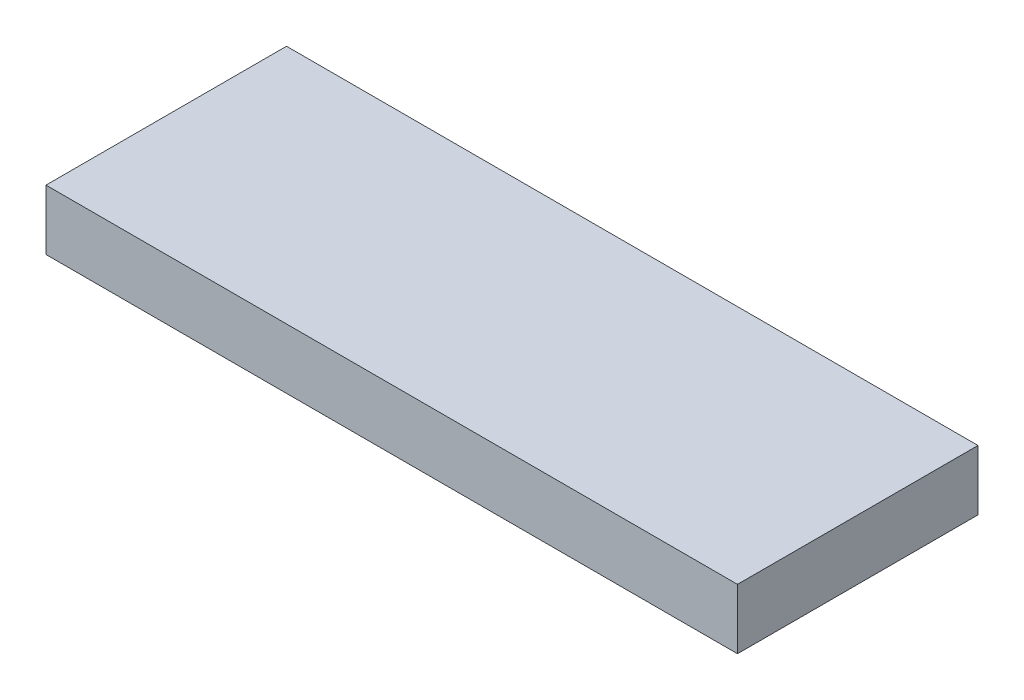
ISO-10303-21;
HEADER;
FILE_DESCRIPTION(('STEP AP214'),'2;1');
FILE_NAME('part.step','',(''),(''),'','','');
FILE_SCHEMA(('AUTOMOTIVE_DESIGN { 1 0 10303 214 1 1 1 1 }'));
ENDSEC;
DATA;
#1=APPLICATION_CONTEXT('core data for automotive mechanical design processes');
#2=APPLICATION_PROTOCOL_DEFINITION('international standard','automotive_design',2000,#1);
#3=PRODUCT_CONTEXT('',#1,'mechanical');
#4=PRODUCT('Part','Part','',(#3));
#5=PRODUCT_RELATED_PRODUCT_CATEGORY('part','',(#4));
#6=PRODUCT_DEFINITION_FORMATION('','',#4);
#7=PRODUCT_DEFINITION_CONTEXT('part definition',#1,'design');
#8=PRODUCT_DEFINITION('design','',#6,#7);
#9=PRODUCT_DEFINITION_SHAPE('','',#8);
#10=(LENGTH_UNIT() NAMED_UNIT(*) SI_UNIT(.MILLI.,.METRE.));
#11=(NAMED_UNIT(*) PLANE_ANGLE_UNIT() SI_UNIT($,.RADIAN.));
#12=(NAMED_UNIT(*) SI_UNIT($,.STERADIAN.) SOLID_ANGLE_UNIT());
#13=UNCERTAINTY_MEASURE_WITH_UNIT(LENGTH_MEASURE(1.E-05),#10,'distance_accuracy_value','');
#14=(GEOMETRIC_REPRESENTATION_CONTEXT(3) GLOBAL_UNCERTAINTY_ASSIGNED_CONTEXT((#13)) GLOBAL_UNIT_ASSIGNED_CONTEXT((#10,
#11,#12)) REPRESENTATION_CONTEXT('',''));
#15=CARTESIAN_POINT('',(0.,0.,0.));
#16=DIRECTION('',(0.,0.,1.));
#17=DIRECTION('',(1.,0.,0.));
#18=AXIS2_PLACEMENT_3D('',#15,#16,#17);
#19=CARTESIAN_POINT('',(0.,6.35,0.));
#20=DIRECTION('',(1.,0.,0.));
#21=DIRECTION('',(0.,0.,-1.));
#22=AXIS2_PLACEMENT_3D('',#19,#20,#21);
#23=PLANE('',#22);
#24=DIRECTION('',(0.,0.,1.));
#25=VECTOR('',#24,1.);
#26=CARTESIAN_POINT('',(0.,0.,0.));
#27=LINE('',#26,#25);
#28=CARTESIAN_POINT('',(0.,0.,-25.4));
#29=VERTEX_POINT('',#28);
#30=CARTESIAN_POINT('',(0.,0.,0.));
#31=VERTEX_POINT('',#30);
#32=EDGE_CURVE('E102',#29,#31,#27,.T.);
#33=ORIENTED_EDGE('',*,*,#32,.T.);
#34=DIRECTION('',(0.,-1.,0.));
#35=VECTOR('',#34,1.);
#36=CARTESIAN_POINT('',(0.,6.35,0.));
#37=LINE('',#36,#35);
#38=CARTESIAN_POINT('',(0.,6.35,0.));
#39=VERTEX_POINT('',#38);
#40=EDGE_CURVE('E11',#39,#31,#37,.T.);
#41=ORIENTED_EDGE('',*,*,#40,.F.);
#42=DIRECTION('',(0.,0.,1.));
#43=VECTOR('',#42,1.);
#44=CARTESIAN_POINT('',(0.,6.35,0.));
#45=LINE('',#44,#43);
#46=CARTESIAN_POINT('',(0.,6.35,-25.4));
#47=VERTEX_POINT('',#46);
#48=EDGE_CURVE('E90',#47,#39,#45,.T.);
#49=ORIENTED_EDGE('',*,*,#48,.F.);
#50=DIRECTION('',(0.,-1.,0.));
#51=VECTOR('',#50,1.);
#52=CARTESIAN_POINT('',(0.,6.35,-25.4));
#53=LINE('',#52,#51);
#54=EDGE_CURVE('E98',#47,#29,#53,.T.);
#55=ORIENTED_EDGE('',*,*,#54,.T.);
#56=EDGE_LOOP('',(#33,#41,#49,#55));
#57=FACE_BOUND('',#56,.T.);
#58=ADVANCED_FACE('F39',(#57),#23,.F.);
#59=CARTESIAN_POINT('',(0.,6.35,0.));
#60=DIRECTION('',(0.,0.,-1.));
#61=DIRECTION('',(-1.,0.,0.));
#62=AXIS2_PLACEMENT_3D('',#59,#60,#61);
#63=PLANE('',#62);
#64=DIRECTION('',(1.,0.,0.));
#65=VECTOR('',#64,1.);
#66=CARTESIAN_POINT('',(0.,0.,0.));
#67=LINE('',#66,#65);
#68=CARTESIAN_POINT('',(73.025,0.,0.));
#69=VERTEX_POINT('',#68);
#70=EDGE_CURVE('E94',#31,#69,#67,.T.);
#71=ORIENTED_EDGE('',*,*,#70,.T.);
#72=DIRECTION('',(0.,-1.,0.));
#73=VECTOR('',#72,1.);
#74=CARTESIAN_POINT('',(73.025,6.35,0.));
#75=LINE('',#74,#73);
#76=CARTESIAN_POINT('',(73.025,6.35,0.));
#77=VERTEX_POINT('',#76);
#78=EDGE_CURVE('E47',#77,#69,#75,.T.);
#79=ORIENTED_EDGE('',*,*,#78,.F.);
#80=DIRECTION('',(1.,0.,0.));
#81=VECTOR('',#80,1.);
#82=CARTESIAN_POINT('',(0.,6.35,0.));
#83=LINE('',#82,#81);
#84=EDGE_CURVE('E85',#39,#77,#83,.T.);
#85=ORIENTED_EDGE('',*,*,#84,.F.);
#86=ORIENTED_EDGE('',*,*,#40,.T.);
#87=EDGE_LOOP('',(#71,#79,#85,#86));
#88=FACE_BOUND('',#87,.T.);
#89=ADVANCED_FACE('F93',(#88),#63,.F.);
#90=CARTESIAN_POINT('',(73.025,6.35,-25.4));
#91=DIRECTION('',(-1.,0.,0.));
#92=DIRECTION('',(0.,0.,1.));
#93=AXIS2_PLACEMENT_3D('',#90,#91,#92);
#94=PLANE('',#93);
#95=DIRECTION('',(0.,0.,-1.));
#96=VECTOR('',#95,1.);
#97=CARTESIAN_POINT('',(73.025,0.,-25.4));
#98=LINE('',#97,#96);
#99=CARTESIAN_POINT('',(73.025,0.,-25.4));
#100=VERTEX_POINT('',#99);
#101=EDGE_CURVE('E72',#69,#100,#98,.T.);
#102=ORIENTED_EDGE('',*,*,#101,.T.);
#103=DIRECTION('',(0.,-1.,0.));
#104=VECTOR('',#103,1.);
#105=CARTESIAN_POINT('',(73.025,6.35,-25.4));
#106=LINE('',#105,#104);
#107=CARTESIAN_POINT('',(73.025,6.35,-25.4));
#108=VERTEX_POINT('',#107);
#109=EDGE_CURVE('E95',#108,#100,#106,.T.);
#110=ORIENTED_EDGE('',*,*,#109,.F.);
#111=DIRECTION('',(0.,0.,-1.));
#112=VECTOR('',#111,1.);
#113=CARTESIAN_POINT('',(73.025,6.35,-25.4));
#114=LINE('',#113,#112);
#115=EDGE_CURVE('E88',#77,#108,#114,.T.);
#116=ORIENTED_EDGE('',*,*,#115,.F.);
#117=ORIENTED_EDGE('',*,*,#78,.T.);
#118=EDGE_LOOP('',(#102,#110,#116,#117));
#119=FACE_BOUND('',#118,.T.);
#120=ADVANCED_FACE('F96',(#119),#94,.F.);
#121=CARTESIAN_POINT('',(0.,6.35,-25.4));
#122=DIRECTION('',(0.,0.,1.));
#123=DIRECTION('',(1.,0.,0.));
#124=AXIS2_PLACEMENT_3D('',#121,#122,#123);
#125=PLANE('',#124);
#126=DIRECTION('',(-1.,0.,0.));
#127=VECTOR('',#126,1.);
#128=CARTESIAN_POINT('',(0.,0.,-25.4));
#129=LINE('',#128,#127);
#130=EDGE_CURVE('E78',#100,#29,#129,.T.);
#131=ORIENTED_EDGE('',*,*,#130,.T.);
#132=ORIENTED_EDGE('',*,*,#54,.F.);
#133=DIRECTION('',(-1.,0.,0.));
#134=VECTOR('',#133,1.);
#135=CARTESIAN_POINT('',(0.,6.35,-25.4));
#136=LINE('',#135,#134);
#137=EDGE_CURVE('E55',#108,#47,#136,.T.);
#138=ORIENTED_EDGE('',*,*,#137,.F.);
#139=ORIENTED_EDGE('',*,*,#109,.T.);
#140=EDGE_LOOP('',(#131,#132,#138,#139));
#141=FACE_BOUND('',#140,.T.);
#142=ADVANCED_FACE('F109',(#141),#125,.F.);
#143=CARTESIAN_POINT('',(0.,6.35,0.));
#144=DIRECTION('',(0.,-1.,0.));
#145=DIRECTION('',(0.,0.,-1.));
#146=AXIS2_PLACEMENT_3D('',#143,#144,#145);
#147=PLANE('',#146);
#148=ORIENTED_EDGE('',*,*,#48,.T.);
#149=ORIENTED_EDGE('',*,*,#84,.T.);
#150=ORIENTED_EDGE('',*,*,#115,.T.);
#151=ORIENTED_EDGE('',*,*,#137,.T.);
#152=EDGE_LOOP('',(#148,#149,#150,#151));
#153=FACE_BOUND('',#152,.T.);
#154=ADVANCED_FACE('F86',(#153),#147,.F.);
#155=CARTESIAN_POINT('',(0.,0.,0.));
#156=DIRECTION('',(0.,-1.,0.));
#157=DIRECTION('',(0.,0.,-1.));
#158=AXIS2_PLACEMENT_3D('',#155,#156,#157);
#159=PLANE('',#158);
#160=ORIENTED_EDGE('',*,*,#32,.F.);
#161=ORIENTED_EDGE('',*,*,#130,.F.);
#162=ORIENTED_EDGE('',*,*,#101,.F.);
#163=ORIENTED_EDGE('',*,*,#70,.F.);
#164=EDGE_LOOP('',(#160,#161,#162,#163));
#165=FACE_BOUND('',#164,.T.);
#166=ADVANCED_FACE('F112',(#165),#159,.T.);
#167=CLOSED_SHELL('',(#58,#89,#120,#142,#154,#166));
#168=MANIFOLD_SOLID_BREP('B2',#167);
#169=ADVANCED_BREP_SHAPE_REPRESENTATION('',(#18,#168),#14);
#170=SHAPE_DEFINITION_REPRESENTATION(#9,#169);
ENDSEC;
END-ISO-10303-21;
